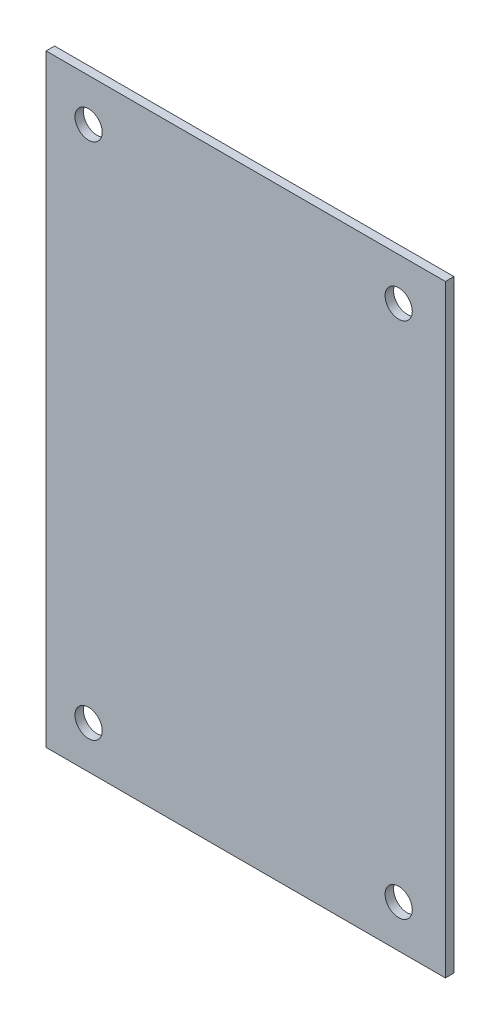
ISO-10303-21;
HEADER;
FILE_DESCRIPTION(('STEP AP214'),'2;1');
FILE_NAME('part.step','',(''),(''),'','','');
FILE_SCHEMA(('AUTOMOTIVE_DESIGN { 1 0 10303 214 1 1 1 1 }'));
ENDSEC;
DATA;
#1=APPLICATION_CONTEXT('core data for automotive mechanical design processes');
#2=APPLICATION_PROTOCOL_DEFINITION('international standard','automotive_design',2000,#1);
#3=PRODUCT_CONTEXT('',#1,'mechanical');
#4=PRODUCT('Part','Part','',(#3));
#5=PRODUCT_RELATED_PRODUCT_CATEGORY('part','',(#4));
#6=PRODUCT_DEFINITION_FORMATION('','',#4);
#7=PRODUCT_DEFINITION_CONTEXT('part definition',#1,'design');
#8=PRODUCT_DEFINITION('design','',#6,#7);
#9=PRODUCT_DEFINITION_SHAPE('','',#8);
#10=(LENGTH_UNIT() NAMED_UNIT(*) SI_UNIT(.MILLI.,.METRE.));
#11=(NAMED_UNIT(*) PLANE_ANGLE_UNIT() SI_UNIT($,.RADIAN.));
#12=(NAMED_UNIT(*) SI_UNIT($,.STERADIAN.) SOLID_ANGLE_UNIT());
#13=UNCERTAINTY_MEASURE_WITH_UNIT(LENGTH_MEASURE(1.E-05),#10,'distance_accuracy_value','');
#14=(GEOMETRIC_REPRESENTATION_CONTEXT(3) GLOBAL_UNCERTAINTY_ASSIGNED_CONTEXT((#13)) GLOBAL_UNIT_ASSIGNED_CONTEXT((#10,
#11,#12)) REPRESENTATION_CONTEXT('',''));
#15=CARTESIAN_POINT('',(0.,0.,0.));
#16=DIRECTION('',(0.,0.,1.));
#17=DIRECTION('',(1.,0.,0.));
#18=AXIS2_PLACEMENT_3D('',#15,#16,#17);
#19=CARTESIAN_POINT('',(-23.5,35.5,1.));
#20=DIRECTION('',(1.,0.,0.));
#21=DIRECTION('',(0.,1.,0.));
#22=AXIS2_PLACEMENT_3D('',#19,#20,#21);
#23=PLANE('',#22);
#24=DIRECTION('',(0.,-1.,0.));
#25=VECTOR('',#24,1.);
#26=CARTESIAN_POINT('',(-23.5,35.5,0.));
#27=LINE('',#26,#25);
#28=CARTESIAN_POINT('',(-23.5,35.5,0.));
#29=VERTEX_POINT('',#28);
#30=CARTESIAN_POINT('',(-23.5,-35.5,0.));
#31=VERTEX_POINT('',#30);
#32=EDGE_CURVE('E100',#29,#31,#27,.T.);
#33=ORIENTED_EDGE('',*,*,#32,.T.);
#34=DIRECTION('',(0.,0.,-1.));
#35=VECTOR('',#34,1.);
#36=CARTESIAN_POINT('',(-23.5,-35.5,1.));
#37=LINE('',#36,#35);
#38=CARTESIAN_POINT('',(-23.5,-35.5,1.));
#39=VERTEX_POINT('',#38);
#40=EDGE_CURVE('E91',#39,#31,#37,.T.);
#41=ORIENTED_EDGE('',*,*,#40,.F.);
#42=DIRECTION('',(0.,-1.,0.));
#43=VECTOR('',#42,1.);
#44=CARTESIAN_POINT('',(-23.5,35.5,1.));
#45=LINE('',#44,#43);
#46=CARTESIAN_POINT('',(-23.5,35.5,1.));
#47=VERTEX_POINT('',#46);
#48=EDGE_CURVE('E85',#47,#39,#45,.T.);
#49=ORIENTED_EDGE('',*,*,#48,.F.);
#50=DIRECTION('',(0.,0.,-1.));
#51=VECTOR('',#50,1.);
#52=CARTESIAN_POINT('',(-23.5,35.5,1.));
#53=LINE('',#52,#51);
#54=EDGE_CURVE('E96',#47,#29,#53,.T.);
#55=ORIENTED_EDGE('',*,*,#54,.T.);
#56=EDGE_LOOP('',(#33,#41,#49,#55));
#57=FACE_BOUND('',#56,.T.);
#58=ADVANCED_FACE('F31',(#57),#23,.F.);
#59=CARTESIAN_POINT('',(-23.5,-35.5,1.));
#60=DIRECTION('',(0.,1.,0.));
#61=DIRECTION('',(-1.,0.,0.));
#62=AXIS2_PLACEMENT_3D('',#59,#60,#61);
#63=PLANE('',#62);
#64=DIRECTION('',(1.,0.,0.));
#65=VECTOR('',#64,1.);
#66=CARTESIAN_POINT('',(-23.5,-35.5,0.));
#67=LINE('',#66,#65);
#68=CARTESIAN_POINT('',(23.5,-35.5,0.));
#69=VERTEX_POINT('',#68);
#70=EDGE_CURVE('E90',#31,#69,#67,.T.);
#71=ORIENTED_EDGE('',*,*,#70,.T.);
#72=DIRECTION('',(0.,0.,-1.));
#73=VECTOR('',#72,1.);
#74=CARTESIAN_POINT('',(23.5,-35.5,1.));
#75=LINE('',#74,#73);
#76=CARTESIAN_POINT('',(23.5,-35.5,1.));
#77=VERTEX_POINT('',#76);
#78=EDGE_CURVE('E88',#77,#69,#75,.T.);
#79=ORIENTED_EDGE('',*,*,#78,.F.);
#80=DIRECTION('',(1.,0.,0.));
#81=VECTOR('',#80,1.);
#82=CARTESIAN_POINT('',(-23.5,-35.5,1.));
#83=LINE('',#82,#81);
#84=EDGE_CURVE('E79',#39,#77,#83,.T.);
#85=ORIENTED_EDGE('',*,*,#84,.F.);
#86=ORIENTED_EDGE('',*,*,#40,.T.);
#87=EDGE_LOOP('',(#71,#79,#85,#86));
#88=FACE_BOUND('',#87,.T.);
#89=ADVANCED_FACE('F89',(#88),#63,.F.);
#90=CARTESIAN_POINT('',(23.5,35.5,1.));
#91=DIRECTION('',(-1.,0.,0.));
#92=DIRECTION('',(0.,-1.,0.));
#93=AXIS2_PLACEMENT_3D('',#90,#91,#92);
#94=PLANE('',#93);
#95=DIRECTION('',(0.,1.,0.));
#96=VECTOR('',#95,1.);
#97=CARTESIAN_POINT('',(23.5,35.5,0.));
#98=LINE('',#97,#96);
#99=CARTESIAN_POINT('',(23.5,35.5,0.));
#100=VERTEX_POINT('',#99);
#101=EDGE_CURVE('E65',#69,#100,#98,.T.);
#102=ORIENTED_EDGE('',*,*,#101,.T.);
#103=DIRECTION('',(0.,0.,-1.));
#104=VECTOR('',#103,1.);
#105=CARTESIAN_POINT('',(23.5,35.5,1.));
#106=LINE('',#105,#104);
#107=CARTESIAN_POINT('',(23.5,35.5,1.));
#108=VERTEX_POINT('',#107);
#109=EDGE_CURVE('E92',#108,#100,#106,.T.);
#110=ORIENTED_EDGE('',*,*,#109,.F.);
#111=DIRECTION('',(0.,1.,0.));
#112=VECTOR('',#111,1.);
#113=CARTESIAN_POINT('',(23.5,35.5,1.));
#114=LINE('',#113,#112);
#115=EDGE_CURVE('E83',#77,#108,#114,.T.);
#116=ORIENTED_EDGE('',*,*,#115,.F.);
#117=ORIENTED_EDGE('',*,*,#78,.T.);
#118=EDGE_LOOP('',(#102,#110,#116,#117));
#119=FACE_BOUND('',#118,.T.);
#120=ADVANCED_FACE('F94',(#119),#94,.F.);
#121=CARTESIAN_POINT('',(-23.5,35.5,1.));
#122=DIRECTION('',(0.,-1.,0.));
#123=DIRECTION('',(0.,0.,-1.));
#124=AXIS2_PLACEMENT_3D('',#121,#122,#123);
#125=PLANE('',#124);
#126=DIRECTION('',(-1.,0.,0.));
#127=VECTOR('',#126,1.);
#128=CARTESIAN_POINT('',(-23.5,35.5,0.));
#129=LINE('',#128,#127);
#130=EDGE_CURVE('E71',#100,#29,#129,.T.);
#131=ORIENTED_EDGE('',*,*,#130,.T.);
#132=ORIENTED_EDGE('',*,*,#54,.F.);
#133=DIRECTION('',(-1.,0.,0.));
#134=VECTOR('',#133,1.);
#135=CARTESIAN_POINT('',(-23.5,35.5,1.));
#136=LINE('',#135,#134);
#137=EDGE_CURVE('E48',#108,#47,#136,.T.);
#138=ORIENTED_EDGE('',*,*,#137,.F.);
#139=ORIENTED_EDGE('',*,*,#109,.T.);
#140=EDGE_LOOP('',(#131,#132,#138,#139));
#141=FACE_BOUND('',#140,.T.);
#142=ADVANCED_FACE('F126',(#141),#125,.F.);
#143=CARTESIAN_POINT('',(-23.5,-35.5,1.));
#144=DIRECTION('',(0.,0.,1.));
#145=DIRECTION('',(1.,0.,0.));
#146=AXIS2_PLACEMENT_3D('',#143,#144,#145);
#147=PLANE('',#146);
#148=CARTESIAN_POINT('',(18.,-30.5,1.));
#149=DIRECTION('',(0.,0.,1.));
#150=DIRECTION('',(1.,0.,0.));
#151=AXIS2_PLACEMENT_3D('',#148,#149,#150);
#152=CIRCLE('',#151,1.6);
#153=CARTESIAN_POINT('',(19.6,-30.5,1.));
#154=VERTEX_POINT('',#153);
#155=EDGE_CURVE('E169',#154,#154,#152,.T.);
#156=ORIENTED_EDGE('',*,*,#155,.F.);
#157=EDGE_LOOP('',(#156));
#158=FACE_BOUND('',#157,.T.);
#159=CARTESIAN_POINT('',(-18.5,-30.5,1.));
#160=DIRECTION('',(0.,0.,1.));
#161=DIRECTION('',(1.,0.,0.));
#162=AXIS2_PLACEMENT_3D('',#159,#160,#161);
#163=CIRCLE('',#162,1.6);
#164=CARTESIAN_POINT('',(-16.9,-30.5,1.));
#165=VERTEX_POINT('',#164);
#166=EDGE_CURVE('E170',#165,#165,#163,.T.);
#167=ORIENTED_EDGE('',*,*,#166,.F.);
#168=EDGE_LOOP('',(#167));
#169=FACE_BOUND('',#168,.T.);
#170=ORIENTED_EDGE('',*,*,#48,.T.);
#171=ORIENTED_EDGE('',*,*,#84,.T.);
#172=ORIENTED_EDGE('',*,*,#115,.T.);
#173=ORIENTED_EDGE('',*,*,#137,.T.);
#174=EDGE_LOOP('',(#170,#171,#172,#173));
#175=FACE_BOUND('',#174,.T.);
#176=CARTESIAN_POINT('',(-18.5,30.5,1.));
#177=DIRECTION('',(0.,0.,1.));
#178=DIRECTION('',(1.,0.,0.));
#179=AXIS2_PLACEMENT_3D('',#176,#177,#178);
#180=CIRCLE('',#179,1.6);
#181=CARTESIAN_POINT('',(-16.9,30.5,1.));
#182=VERTEX_POINT('',#181);
#183=EDGE_CURVE('E113',#182,#182,#180,.T.);
#184=ORIENTED_EDGE('',*,*,#183,.F.);
#185=EDGE_LOOP('',(#184));
#186=FACE_BOUND('',#185,.T.);
#187=CARTESIAN_POINT('',(18.,30.5,1.));
#188=DIRECTION('',(0.,0.,1.));
#189=DIRECTION('',(1.,0.,0.));
#190=AXIS2_PLACEMENT_3D('',#187,#188,#189);
#191=CIRCLE('',#190,1.6);
#192=CARTESIAN_POINT('',(19.6,30.5,1.));
#193=VERTEX_POINT('',#192);
#194=EDGE_CURVE('E11',#193,#193,#191,.T.);
#195=ORIENTED_EDGE('',*,*,#194,.F.);
#196=EDGE_LOOP('',(#195));
#197=FACE_BOUND('',#196,.T.);
#198=ADVANCED_FACE('F80',(#158,#169,#175,#186,#197),#147,.T.);
#199=CARTESIAN_POINT('',(-23.5,-35.5,0.));
#200=DIRECTION('',(0.,0.,1.));
#201=DIRECTION('',(1.,0.,0.));
#202=AXIS2_PLACEMENT_3D('',#199,#200,#201);
#203=PLANE('',#202);
#204=CARTESIAN_POINT('',(18.,-30.5,0.));
#205=DIRECTION('',(0.,0.,1.));
#206=DIRECTION('',(1.,0.,0.));
#207=AXIS2_PLACEMENT_3D('',#204,#205,#206);
#208=CIRCLE('',#207,1.6);
#209=CARTESIAN_POINT('',(19.6,-30.5,0.));
#210=VERTEX_POINT('',#209);
#211=EDGE_CURVE('E167',#210,#210,#208,.T.);
#212=ORIENTED_EDGE('',*,*,#211,.T.);
#213=EDGE_LOOP('',(#212));
#214=FACE_BOUND('',#213,.T.);
#215=CARTESIAN_POINT('',(-18.5,-30.5,0.));
#216=DIRECTION('',(0.,0.,1.));
#217=DIRECTION('',(1.,0.,0.));
#218=AXIS2_PLACEMENT_3D('',#215,#216,#217);
#219=CIRCLE('',#218,1.6);
#220=CARTESIAN_POINT('',(-16.9,-30.5,0.));
#221=VERTEX_POINT('',#220);
#222=EDGE_CURVE('E103',#221,#221,#219,.T.);
#223=ORIENTED_EDGE('',*,*,#222,.T.);
#224=EDGE_LOOP('',(#223));
#225=FACE_BOUND('',#224,.T.);
#226=ORIENTED_EDGE('',*,*,#32,.F.);
#227=ORIENTED_EDGE('',*,*,#130,.F.);
#228=ORIENTED_EDGE('',*,*,#101,.F.);
#229=ORIENTED_EDGE('',*,*,#70,.F.);
#230=EDGE_LOOP('',(#226,#227,#228,#229));
#231=FACE_BOUND('',#230,.T.);
#232=CARTESIAN_POINT('',(-18.5,30.5,0.));
#233=DIRECTION('',(0.,0.,1.));
#234=DIRECTION('',(1.,0.,0.));
#235=AXIS2_PLACEMENT_3D('',#232,#233,#234);
#236=CIRCLE('',#235,1.6);
#237=CARTESIAN_POINT('',(-16.9,30.5,0.));
#238=VERTEX_POINT('',#237);
#239=EDGE_CURVE('E110',#238,#238,#236,.T.);
#240=ORIENTED_EDGE('',*,*,#239,.T.);
#241=EDGE_LOOP('',(#240));
#242=FACE_BOUND('',#241,.T.);
#243=CARTESIAN_POINT('',(18.,30.5,0.));
#244=DIRECTION('',(0.,0.,1.));
#245=DIRECTION('',(1.,0.,0.));
#246=AXIS2_PLACEMENT_3D('',#243,#244,#245);
#247=CIRCLE('',#246,1.6);
#248=CARTESIAN_POINT('',(19.6,30.5,0.));
#249=VERTEX_POINT('',#248);
#250=EDGE_CURVE('E40',#249,#249,#247,.T.);
#251=ORIENTED_EDGE('',*,*,#250,.T.);
#252=EDGE_LOOP('',(#251));
#253=FACE_BOUND('',#252,.T.);
#254=ADVANCED_FACE('F118',(#214,#225,#231,#242,#253),#203,.F.);
#255=CARTESIAN_POINT('',(-18.5,-30.5,0.));
#256=DIRECTION('',(0.,0.,1.));
#257=DIRECTION('',(1.,0.,0.));
#258=AXIS2_PLACEMENT_3D('',#255,#256,#257);
#259=CYLINDRICAL_SURFACE('',#258,1.6);
#260=ORIENTED_EDGE('',*,*,#222,.F.);
#261=EDGE_LOOP('',(#260));
#262=FACE_BOUND('',#261,.T.);
#263=ORIENTED_EDGE('',*,*,#166,.T.);
#264=EDGE_LOOP('',(#263));
#265=FACE_BOUND('',#264,.T.);
#266=ADVANCED_FACE('F133',(#262,#265),#259,.F.);
#267=CARTESIAN_POINT('',(18.,-30.5,0.));
#268=DIRECTION('',(0.,0.,1.));
#269=DIRECTION('',(1.,0.,0.));
#270=AXIS2_PLACEMENT_3D('',#267,#268,#269);
#271=CYLINDRICAL_SURFACE('',#270,1.6);
#272=ORIENTED_EDGE('',*,*,#211,.F.);
#273=EDGE_LOOP('',(#272));
#274=FACE_BOUND('',#273,.T.);
#275=ORIENTED_EDGE('',*,*,#155,.T.);
#276=EDGE_LOOP('',(#275));
#277=FACE_BOUND('',#276,.T.);
#278=ADVANCED_FACE('F149',(#274,#277),#271,.F.);
#279=CARTESIAN_POINT('',(-18.5,30.5,0.));
#280=DIRECTION('',(0.,0.,1.));
#281=DIRECTION('',(1.,0.,0.));
#282=AXIS2_PLACEMENT_3D('',#279,#280,#281);
#283=CYLINDRICAL_SURFACE('',#282,1.6);
#284=ORIENTED_EDGE('',*,*,#239,.F.);
#285=EDGE_LOOP('',(#284));
#286=FACE_BOUND('',#285,.T.);
#287=ORIENTED_EDGE('',*,*,#183,.T.);
#288=EDGE_LOOP('',(#287));
#289=FACE_BOUND('',#288,.T.);
#290=ADVANCED_FACE('F122',(#286,#289),#283,.F.);
#291=CARTESIAN_POINT('',(18.,30.5,0.));
#292=DIRECTION('',(0.,0.,1.));
#293=DIRECTION('',(1.,0.,0.));
#294=AXIS2_PLACEMENT_3D('',#291,#292,#293);
#295=CYLINDRICAL_SURFACE('',#294,1.6);
#296=ORIENTED_EDGE('',*,*,#250,.F.);
#297=EDGE_LOOP('',(#296));
#298=FACE_BOUND('',#297,.T.);
#299=ORIENTED_EDGE('',*,*,#194,.T.);
#300=EDGE_LOOP('',(#299));
#301=FACE_BOUND('',#300,.T.);
#302=ADVANCED_FACE('F33',(#298,#301),#295,.F.);
#303=CLOSED_SHELL('',(#58,#89,#120,#142,#198,#254,#266,#278,#290,#302));
#304=MANIFOLD_SOLID_BREP('B2',#303);
#305=ADVANCED_BREP_SHAPE_REPRESENTATION('',(#18,#304),#14);
#306=SHAPE_DEFINITION_REPRESENTATION(#9,#305);
ENDSEC;
END-ISO-10303-21;
